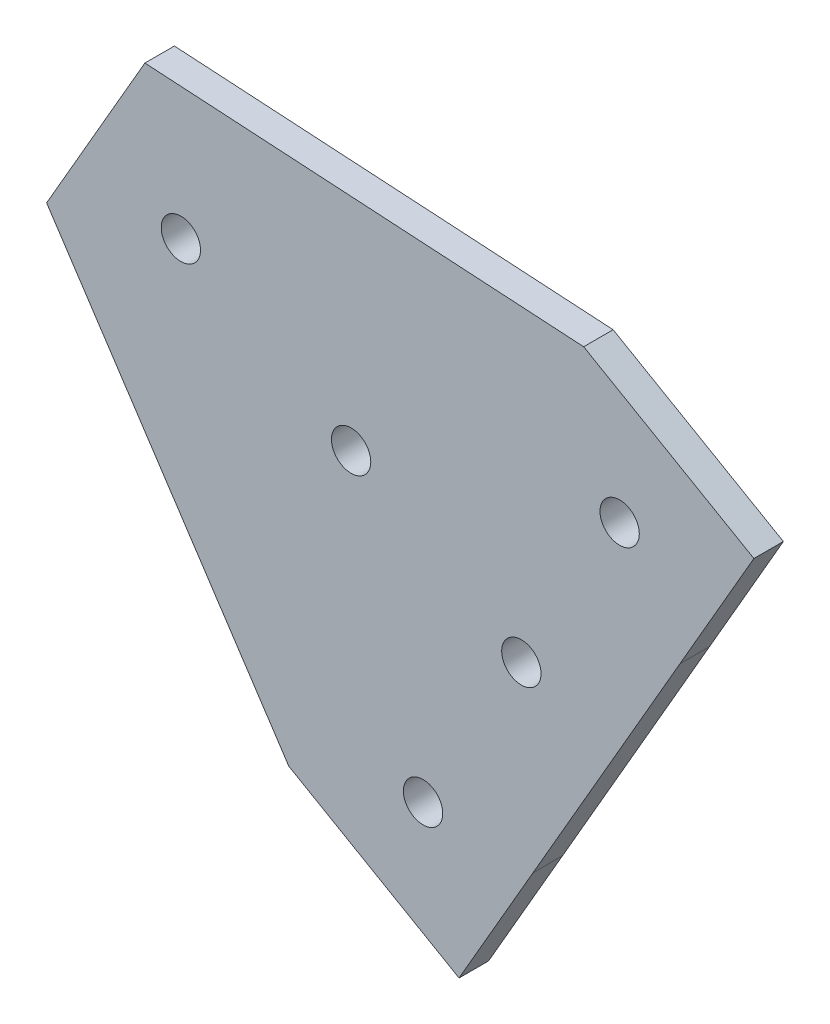
ISO-10303-21;
HEADER;
FILE_DESCRIPTION(('STEP AP214'),'2;1');
FILE_NAME('part.step','',(''),(''),'','','');
FILE_SCHEMA(('AUTOMOTIVE_DESIGN { 1 0 10303 214 1 1 1 1 }'));
ENDSEC;
DATA;
#1=APPLICATION_CONTEXT('core data for automotive mechanical design processes');
#2=APPLICATION_PROTOCOL_DEFINITION('international standard','automotive_design',2000,#1);
#3=PRODUCT_CONTEXT('',#1,'mechanical');
#4=PRODUCT('Part','Part','',(#3));
#5=PRODUCT_RELATED_PRODUCT_CATEGORY('part','',(#4));
#6=PRODUCT_DEFINITION_FORMATION('','',#4);
#7=PRODUCT_DEFINITION_CONTEXT('part definition',#1,'design');
#8=PRODUCT_DEFINITION('design','',#6,#7);
#9=PRODUCT_DEFINITION_SHAPE('','',#8);
#10=(LENGTH_UNIT() NAMED_UNIT(*) SI_UNIT(.MILLI.,.METRE.));
#11=(NAMED_UNIT(*) PLANE_ANGLE_UNIT() SI_UNIT($,.RADIAN.));
#12=(NAMED_UNIT(*) SI_UNIT($,.STERADIAN.) SOLID_ANGLE_UNIT());
#13=UNCERTAINTY_MEASURE_WITH_UNIT(LENGTH_MEASURE(1.E-05),#10,'distance_accuracy_value','');
#14=(GEOMETRIC_REPRESENTATION_CONTEXT(3) GLOBAL_UNCERTAINTY_ASSIGNED_CONTEXT((#13)) GLOBAL_UNIT_ASSIGNED_CONTEXT((#10,
#11,#12)) REPRESENTATION_CONTEXT('',''));
#15=CARTESIAN_POINT('',(0.,0.,0.));
#16=DIRECTION('',(0.,0.,1.));
#17=DIRECTION('',(1.,0.,0.));
#18=AXIS2_PLACEMENT_3D('',#15,#16,#17);
#19=CARTESIAN_POINT('',(-18.8348923040879,-62.367651261605,3.));
#20=DIRECTION('',(0.,0.,1.));
#21=DIRECTION('',(1.,0.,0.));
#22=AXIS2_PLACEMENT_3D('',#19,#20,#21);
#23=PLANE('',#22);
#24=CARTESIAN_POINT('',(-14.3252733608548,-24.5567621291497,3.));
#25=DIRECTION('',(0.,0.,1.));
#26=DIRECTION('',(1.,0.,0.));
#27=AXIS2_PLACEMENT_3D('',#24,#25,#26);
#28=CIRCLE('',#27,2.);
#29=CARTESIAN_POINT('',(-12.3252733608548,-24.5567621291497,3.));
#30=VERTEX_POINT('',#29);
#31=EDGE_CURVE('E271',#30,#30,#28,.T.);
#32=ORIENTED_EDGE('',*,*,#31,.F.);
#33=EDGE_LOOP('',(#32));
#34=FACE_BOUND('',#33,.T.);
#35=CARTESIAN_POINT('',(-41.6457814365435,-31.8772702048387,3.));
#36=DIRECTION('',(0.,0.,1.));
#37=DIRECTION('',(1.,0.,0.));
#38=AXIS2_PLACEMENT_3D('',#35,#36,#37);
#39=CIRCLE('',#38,1.99999999999994);
#40=CARTESIAN_POINT('',(-39.6457814365435,-31.8772702048387,3.));
#41=VERTEX_POINT('',#40);
#42=EDGE_CURVE('E255',#41,#41,#39,.T.);
#43=ORIENTED_EDGE('',*,*,#42,.F.);
#44=EDGE_LOOP('',(#43));
#45=FACE_BOUND('',#44,.T.);
#46=CARTESIAN_POINT('',(-18.8348923040879,-62.367651261605,3.));
#47=DIRECTION('',(0.,0.,-1.));
#48=DIRECTION('',(1.,0.,0.));
#49=AXIS2_PLACEMENT_3D('',#46,#47,#48);
#50=CIRCLE('',#49,5.);
#51=CARTESIAN_POINT('',(-23.1650193230101,-59.8676512616051,3.));
#52=VERTEX_POINT('',#51);
#53=CARTESIAN_POINT('',(-23.1177410915224,-59.7874950136289,3.));
#54=VERTEX_POINT('',#53);
#55=EDGE_CURVE('E188',#52,#54,#50,.T.);
#56=ORIENTED_EDGE('',*,*,#55,.T.);
#57=DIRECTION('',(0.499999999999993,0.866025403784442,0.));
#58=VECTOR('',#57,1.);
#59=CARTESIAN_POINT('',(-23.1177410915224,-59.7874950136289,3.));
#60=LINE('',#59,#58);
#61=CARTESIAN_POINT('',(-8.21079755428733,-33.9679114215767,3.));
#62=VERTEX_POINT('',#61);
#63=EDGE_CURVE('E112',#54,#62,#60,.T.);
#64=ORIENTED_EDGE('',*,*,#63,.T.);
#65=CARTESIAN_POINT('',(-3.83489230408807,-36.3868891480718,3.));
#66=DIRECTION('',(0.,0.,-1.));
#67=DIRECTION('',(1.,0.,0.));
#68=AXIS2_PLACEMENT_3D('',#65,#66,#67);
#69=CIRCLE('',#68,5.00000000000002);
#70=CARTESIAN_POINT('',(-8.16501932301031,-33.8868891480718,3.));
#71=VERTEX_POINT('',#70);
#72=EDGE_CURVE('E217',#62,#71,#69,.T.);
#73=ORIENTED_EDGE('',*,*,#72,.T.);
#74=DIRECTION('',(0.499999999999993,0.866025403784443,0.));
#75=VECTOR('',#74,1.);
#76=CARTESIAN_POINT('',(-8.16501932301028,-33.8868891480718,3.));
#77=LINE('',#76,#75);
#78=CARTESIAN_POINT('',(-0.665019323010385,-20.8965080913052,3.));
#79=VERTEX_POINT('',#78);
#80=EDGE_CURVE('E237',#71,#79,#77,.T.);
#81=ORIENTED_EDGE('',*,*,#80,.T.);
#82=DIRECTION('',(-0.866025403784442,0.499999999999994,0.));
#83=VECTOR('',#82,1.);
#84=CARTESIAN_POINT('',(-0.665019323010385,-20.8965080913052,3.));
#85=LINE('',#84,#83);
#86=CARTESIAN_POINT('',(-17.9855273986992,-10.8965080913053,3.));
#87=VERTEX_POINT('',#86);
#88=EDGE_CURVE('E233',#79,#87,#85,.T.);
#89=ORIENTED_EDGE('',*,*,#88,.T.);
#90=DIRECTION('',(-0.998203466991463,0.0599152608792073,0.));
#91=VECTOR('',#90,1.);
#92=CARTESIAN_POINT('',(-17.9855273986992,-10.8965080913053,3.));
#93=LINE('',#92,#91);
#94=CARTESIAN_POINT('',(-62.6265435500769,-8.21701616699444,3.));
#95=VERTEX_POINT('',#94);
#96=EDGE_CURVE('E236',#87,#95,#93,.T.);
#97=ORIENTED_EDGE('',*,*,#96,.T.);
#98=DIRECTION('',(-0.499999999999992,-0.866025403784443,0.));
#99=VECTOR('',#98,1.);
#100=CARTESIAN_POINT('',(-62.6265435500769,-8.21701616699444,3.));
#101=LINE('',#100,#99);
#102=CARTESIAN_POINT('',(-72.6265435500767,-25.5375242426833,3.));
#103=VERTEX_POINT('',#102);
#104=EDGE_CURVE('E137',#95,#103,#101,.T.);
#105=ORIENTED_EDGE('',*,*,#104,.T.);
#106=DIRECTION('',(0.550989871491512,-0.834511930120695,0.));
#107=VECTOR('',#106,1.);
#108=CARTESIAN_POINT('',(-72.6265435500767,-25.5375242426833,3.));
#109=LINE('',#108,#107);
#110=CARTESIAN_POINT('',(-47.9855273986988,-62.8580323183718,3.));
#111=VERTEX_POINT('',#110);
#112=EDGE_CURVE('E131',#103,#111,#109,.T.);
#113=ORIENTED_EDGE('',*,*,#112,.T.);
#114=DIRECTION('',(0.866025403784442,-0.499999999999994,0.));
#115=VECTOR('',#114,1.);
#116=CARTESIAN_POINT('',(-47.9855273986988,-62.8580323183718,3.));
#117=LINE('',#116,#115);
#118=CARTESIAN_POINT('',(-30.66501932301,-72.8580323183717,3.));
#119=VERTEX_POINT('',#118);
#120=EDGE_CURVE('E135',#111,#119,#117,.T.);
#121=ORIENTED_EDGE('',*,*,#120,.T.);
#122=DIRECTION('',(0.499999999999993,0.866025403784443,0.));
#123=VECTOR('',#122,1.);
#124=CARTESIAN_POINT('',(-30.66501932301,-72.8580323183717,3.));
#125=LINE('',#124,#123);
#126=EDGE_CURVE('E63',#119,#52,#125,.T.);
#127=ORIENTED_EDGE('',*,*,#126,.T.);
#128=EDGE_LOOP('',(#56,#64,#73,#81,#89,#97,#105,#113,#121,#127));
#129=FACE_BOUND('',#128,.T.);
#130=CARTESIAN_POINT('',(-58.9662895122323,-21.8772702048388,3.));
#131=DIRECTION('',(0.,0.,1.));
#132=DIRECTION('',(1.,0.,0.));
#133=AXIS2_PLACEMENT_3D('',#130,#131,#132);
#134=CIRCLE('',#133,2.);
#135=CARTESIAN_POINT('',(-56.9662895122323,-21.8772702048388,3.));
#136=VERTEX_POINT('',#135);
#137=EDGE_CURVE('E164',#136,#136,#134,.T.);
#138=ORIENTED_EDGE('',*,*,#137,.F.);
#139=EDGE_LOOP('',(#138));
#140=FACE_BOUND('',#139,.T.);
#141=CARTESIAN_POINT('',(-24.3252733608546,-41.8772702048386,3.));
#142=DIRECTION('',(0.,0.,1.));
#143=DIRECTION('',(1.,0.,0.));
#144=AXIS2_PLACEMENT_3D('',#141,#142,#143);
#145=CIRCLE('',#144,2.);
#146=CARTESIAN_POINT('',(-22.3252733608546,-41.8772702048386,3.));
#147=VERTEX_POINT('',#146);
#148=EDGE_CURVE('E263',#147,#147,#145,.T.);
#149=ORIENTED_EDGE('',*,*,#148,.F.);
#150=EDGE_LOOP('',(#149));
#151=FACE_BOUND('',#150,.T.);
#152=CARTESIAN_POINT('',(-34.3252733608544,-59.1977782805274,3.));
#153=DIRECTION('',(0.,0.,1.));
#154=DIRECTION('',(1.,0.,0.));
#155=AXIS2_PLACEMENT_3D('',#152,#153,#154);
#156=CIRCLE('',#155,2.);
#157=CARTESIAN_POINT('',(-32.3252733608545,-59.1977782805274,3.));
#158=VERTEX_POINT('',#157);
#159=EDGE_CURVE('E279',#158,#158,#156,.T.);
#160=ORIENTED_EDGE('',*,*,#159,.F.);
#161=EDGE_LOOP('',(#160));
#162=FACE_BOUND('',#161,.T.);
#163=ADVANCED_FACE('F45',(#34,#45,#129,#140,#151,#162),#23,.T.);
#164=CARTESIAN_POINT('',(-18.8348923040879,-62.367651261605,0.));
#165=DIRECTION('',(0.,0.,1.));
#166=DIRECTION('',(1.,0.,0.));
#167=AXIS2_PLACEMENT_3D('',#164,#165,#166);
#168=PLANE('',#167);
#169=CARTESIAN_POINT('',(-18.8348923040879,-62.367651261605,0.));
#170=DIRECTION('',(0.,0.,-1.));
#171=DIRECTION('',(1.,0.,0.));
#172=AXIS2_PLACEMENT_3D('',#169,#170,#171);
#173=CIRCLE('',#172,5.);
#174=CARTESIAN_POINT('',(-23.1650193230101,-59.8676512616051,0.));
#175=VERTEX_POINT('',#174);
#176=CARTESIAN_POINT('',(-23.1177410915224,-59.7874950136289,0.));
#177=VERTEX_POINT('',#176);
#178=EDGE_CURVE('E159',#175,#177,#173,.T.);
#179=ORIENTED_EDGE('',*,*,#178,.F.);
#180=DIRECTION('',(0.499999999999993,0.866025403784443,0.));
#181=VECTOR('',#180,1.);
#182=CARTESIAN_POINT('',(-30.66501932301,-72.8580323183717,0.));
#183=LINE('',#182,#181);
#184=CARTESIAN_POINT('',(-30.66501932301,-72.8580323183717,0.));
#185=VERTEX_POINT('',#184);
#186=EDGE_CURVE('E104',#185,#175,#183,.T.);
#187=ORIENTED_EDGE('',*,*,#186,.F.);
#188=DIRECTION('',(0.866025403784442,-0.499999999999994,0.));
#189=VECTOR('',#188,1.);
#190=CARTESIAN_POINT('',(-47.9855273986988,-62.8580323183718,0.));
#191=LINE('',#190,#189);
#192=CARTESIAN_POINT('',(-47.9855273986988,-62.8580323183718,0.));
#193=VERTEX_POINT('',#192);
#194=EDGE_CURVE('E98',#193,#185,#191,.T.);
#195=ORIENTED_EDGE('',*,*,#194,.F.);
#196=DIRECTION('',(0.550989871491512,-0.834511930120695,0.));
#197=VECTOR('',#196,1.);
#198=CARTESIAN_POINT('',(-72.6265435500767,-25.5375242426833,0.));
#199=LINE('',#198,#197);
#200=CARTESIAN_POINT('',(-72.6265435500767,-25.5375242426833,0.));
#201=VERTEX_POINT('',#200);
#202=EDGE_CURVE('E146',#201,#193,#199,.T.);
#203=ORIENTED_EDGE('',*,*,#202,.F.);
#204=DIRECTION('',(-0.499999999999992,-0.866025403784443,0.));
#205=VECTOR('',#204,1.);
#206=CARTESIAN_POINT('',(-62.6265435500769,-8.21701616699444,0.));
#207=LINE('',#206,#205);
#208=CARTESIAN_POINT('',(-62.6265435500769,-8.21701616699444,0.));
#209=VERTEX_POINT('',#208);
#210=EDGE_CURVE('E179',#209,#201,#207,.T.);
#211=ORIENTED_EDGE('',*,*,#210,.F.);
#212=DIRECTION('',(-0.998203466991463,0.0599152608792073,0.));
#213=VECTOR('',#212,1.);
#214=CARTESIAN_POINT('',(-17.9855273986992,-10.8965080913053,0.));
#215=LINE('',#214,#213);
#216=CARTESIAN_POINT('',(-17.9855273986992,-10.8965080913053,0.));
#217=VERTEX_POINT('',#216);
#218=EDGE_CURVE('E176',#217,#209,#215,.T.);
#219=ORIENTED_EDGE('',*,*,#218,.F.);
#220=DIRECTION('',(-0.866025403784442,0.499999999999994,0.));
#221=VECTOR('',#220,1.);
#222=CARTESIAN_POINT('',(-0.665019323010385,-20.8965080913052,0.));
#223=LINE('',#222,#221);
#224=CARTESIAN_POINT('',(-0.665019323010385,-20.8965080913052,0.));
#225=VERTEX_POINT('',#224);
#226=EDGE_CURVE('E173',#225,#217,#223,.T.);
#227=ORIENTED_EDGE('',*,*,#226,.F.);
#228=DIRECTION('',(0.499999999999993,0.866025403784443,0.));
#229=VECTOR('',#228,1.);
#230=CARTESIAN_POINT('',(-8.16501932301028,-33.8868891480718,0.));
#231=LINE('',#230,#229);
#232=CARTESIAN_POINT('',(-8.16501932301031,-33.8868891480718,0.));
#233=VERTEX_POINT('',#232);
#234=EDGE_CURVE('E170',#233,#225,#231,.T.);
#235=ORIENTED_EDGE('',*,*,#234,.F.);
#236=CARTESIAN_POINT('',(-3.83489230408807,-36.3868891480718,0.));
#237=DIRECTION('',(0.,0.,-1.));
#238=DIRECTION('',(1.,0.,0.));
#239=AXIS2_PLACEMENT_3D('',#236,#237,#238);
#240=CIRCLE('',#239,5.00000000000002);
#241=CARTESIAN_POINT('',(-8.21079755428733,-33.9679114215767,0.));
#242=VERTEX_POINT('',#241);
#243=EDGE_CURVE('E167',#242,#233,#240,.T.);
#244=ORIENTED_EDGE('',*,*,#243,.F.);
#245=DIRECTION('',(0.499999999999993,0.866025403784442,0.));
#246=VECTOR('',#245,1.);
#247=CARTESIAN_POINT('',(-23.1177410915224,-59.7874950136289,0.));
#248=LINE('',#247,#246);
#249=EDGE_CURVE('E163',#177,#242,#248,.T.);
#250=ORIENTED_EDGE('',*,*,#249,.F.);
#251=EDGE_LOOP('',(#179,#187,#195,#203,#211,#219,#227,#235,#244,#250));
#252=FACE_BOUND('',#251,.T.);
#253=CARTESIAN_POINT('',(-58.9662895122323,-21.8772702048388,0.));
#254=DIRECTION('',(0.,0.,1.));
#255=DIRECTION('',(1.,0.,0.));
#256=AXIS2_PLACEMENT_3D('',#253,#254,#255);
#257=CIRCLE('',#256,2.);
#258=CARTESIAN_POINT('',(-56.9662895122323,-21.8772702048388,0.));
#259=VERTEX_POINT('',#258);
#260=EDGE_CURVE('E251',#259,#259,#257,.T.);
#261=ORIENTED_EDGE('',*,*,#260,.T.);
#262=EDGE_LOOP('',(#261));
#263=FACE_BOUND('',#262,.T.);
#264=CARTESIAN_POINT('',(-41.6457814365435,-31.8772702048387,0.));
#265=DIRECTION('',(0.,0.,1.));
#266=DIRECTION('',(1.,0.,0.));
#267=AXIS2_PLACEMENT_3D('',#264,#265,#266);
#268=CIRCLE('',#267,1.99999999999994);
#269=CARTESIAN_POINT('',(-39.6457814365435,-31.8772702048387,0.));
#270=VERTEX_POINT('',#269);
#271=EDGE_CURVE('E259',#270,#270,#268,.T.);
#272=ORIENTED_EDGE('',*,*,#271,.T.);
#273=EDGE_LOOP('',(#272));
#274=FACE_BOUND('',#273,.T.);
#275=CARTESIAN_POINT('',(-24.3252733608546,-41.8772702048386,0.));
#276=DIRECTION('',(0.,0.,1.));
#277=DIRECTION('',(1.,0.,0.));
#278=AXIS2_PLACEMENT_3D('',#275,#276,#277);
#279=CIRCLE('',#278,2.);
#280=CARTESIAN_POINT('',(-22.3252733608546,-41.8772702048386,0.));
#281=VERTEX_POINT('',#280);
#282=EDGE_CURVE('E267',#281,#281,#279,.T.);
#283=ORIENTED_EDGE('',*,*,#282,.T.);
#284=EDGE_LOOP('',(#283));
#285=FACE_BOUND('',#284,.T.);
#286=CARTESIAN_POINT('',(-14.3252733608548,-24.5567621291497,0.));
#287=DIRECTION('',(0.,0.,1.));
#288=DIRECTION('',(1.,0.,0.));
#289=AXIS2_PLACEMENT_3D('',#286,#287,#288);
#290=CIRCLE('',#289,2.);
#291=CARTESIAN_POINT('',(-12.3252733608548,-24.5567621291497,0.));
#292=VERTEX_POINT('',#291);
#293=EDGE_CURVE('E275',#292,#292,#290,.T.);
#294=ORIENTED_EDGE('',*,*,#293,.T.);
#295=EDGE_LOOP('',(#294));
#296=FACE_BOUND('',#295,.T.);
#297=CARTESIAN_POINT('',(-34.3252733608544,-59.1977782805274,0.));
#298=DIRECTION('',(0.,0.,1.));
#299=DIRECTION('',(1.,0.,0.));
#300=AXIS2_PLACEMENT_3D('',#297,#298,#299);
#301=CIRCLE('',#300,2.);
#302=CARTESIAN_POINT('',(-32.3252733608545,-59.1977782805274,0.));
#303=VERTEX_POINT('',#302);
#304=EDGE_CURVE('E283',#303,#303,#301,.T.);
#305=ORIENTED_EDGE('',*,*,#304,.T.);
#306=EDGE_LOOP('',(#305));
#307=FACE_BOUND('',#306,.T.);
#308=ADVANCED_FACE('F221',(#252,#263,#274,#285,#296,#307),#168,.F.);
#309=CARTESIAN_POINT('',(-18.8348923040879,-62.367651261605,3.));
#310=DIRECTION('',(0.,0.,-1.));
#311=DIRECTION('',(-1.,0.,0.));
#312=AXIS2_PLACEMENT_3D('',#309,#310,#311);
#313=CYLINDRICAL_SURFACE('',#312,5.);
#314=ORIENTED_EDGE('',*,*,#178,.T.);
#315=DIRECTION('',(0.,0.,-1.));
#316=VECTOR('',#315,1.);
#317=CARTESIAN_POINT('',(-23.1177410915224,-59.7874950136289,3.));
#318=LINE('',#317,#316);
#319=EDGE_CURVE('E11',#54,#177,#318,.T.);
#320=ORIENTED_EDGE('',*,*,#319,.F.);
#321=ORIENTED_EDGE('',*,*,#55,.F.);
#322=DIRECTION('',(0.,0.,-1.));
#323=VECTOR('',#322,1.);
#324=CARTESIAN_POINT('',(-23.1650193230101,-59.8676512616051,3.));
#325=LINE('',#324,#323);
#326=EDGE_CURVE('E155',#52,#175,#325,.T.);
#327=ORIENTED_EDGE('',*,*,#326,.T.);
#328=EDGE_LOOP('',(#314,#320,#321,#327));
#329=FACE_BOUND('',#328,.T.);
#330=ADVANCED_FACE('F47',(#329),#313,.F.);
#331=CARTESIAN_POINT('',(-23.1177410915224,-59.7874950136289,3.));
#332=DIRECTION('',(-0.866025403784442,0.499999999999993,0.));
#333=DIRECTION('',(-0.499999999999993,-0.866025403784442,0.));
#334=AXIS2_PLACEMENT_3D('',#331,#332,#333);
#335=PLANE('',#334);
#336=ORIENTED_EDGE('',*,*,#249,.T.);
#337=DIRECTION('',(0.,0.,-1.));
#338=VECTOR('',#337,1.);
#339=CARTESIAN_POINT('',(-8.21079755428733,-33.9679114215767,3.));
#340=LINE('',#339,#338);
#341=EDGE_CURVE('E55',#62,#242,#340,.T.);
#342=ORIENTED_EDGE('',*,*,#341,.F.);
#343=ORIENTED_EDGE('',*,*,#63,.F.);
#344=ORIENTED_EDGE('',*,*,#319,.T.);
#345=EDGE_LOOP('',(#336,#342,#343,#344));
#346=FACE_BOUND('',#345,.T.);
#347=ADVANCED_FACE('F327',(#346),#335,.F.);
#348=CARTESIAN_POINT('',(-3.83489230408807,-36.3868891480718,3.));
#349=DIRECTION('',(0.,0.,-1.));
#350=DIRECTION('',(-1.,0.,0.));
#351=AXIS2_PLACEMENT_3D('',#348,#349,#350);
#352=CYLINDRICAL_SURFACE('',#351,5.00000000000002);
#353=ORIENTED_EDGE('',*,*,#243,.T.);
#354=DIRECTION('',(0.,0.,-1.));
#355=VECTOR('',#354,1.);
#356=CARTESIAN_POINT('',(-8.16501932301031,-33.8868891480718,3.));
#357=LINE('',#356,#355);
#358=EDGE_CURVE('E207',#71,#233,#357,.T.);
#359=ORIENTED_EDGE('',*,*,#358,.F.);
#360=ORIENTED_EDGE('',*,*,#72,.F.);
#361=ORIENTED_EDGE('',*,*,#341,.T.);
#362=EDGE_LOOP('',(#353,#359,#360,#361));
#363=FACE_BOUND('',#362,.T.);
#364=ADVANCED_FACE('F215',(#363),#352,.F.);
#365=CARTESIAN_POINT('',(-8.16501932301028,-33.8868891480718,3.));
#366=DIRECTION('',(-0.866025403784443,0.499999999999993,0.));
#367=DIRECTION('',(-0.499999999999993,-0.866025403784443,0.));
#368=AXIS2_PLACEMENT_3D('',#365,#366,#367);
#369=PLANE('',#368);
#370=ORIENTED_EDGE('',*,*,#234,.T.);
#371=DIRECTION('',(0.,0.,-1.));
#372=VECTOR('',#371,1.);
#373=CARTESIAN_POINT('',(-0.665019323010385,-20.8965080913052,3.));
#374=LINE('',#373,#372);
#375=EDGE_CURVE('E203',#79,#225,#374,.T.);
#376=ORIENTED_EDGE('',*,*,#375,.F.);
#377=ORIENTED_EDGE('',*,*,#80,.F.);
#378=ORIENTED_EDGE('',*,*,#358,.T.);
#379=EDGE_LOOP('',(#370,#376,#377,#378));
#380=FACE_BOUND('',#379,.T.);
#381=ADVANCED_FACE('F227',(#380),#369,.F.);
#382=CARTESIAN_POINT('',(-0.665019323010385,-20.8965080913052,3.));
#383=DIRECTION('',(-0.499999999999994,-0.866025403784442,0.));
#384=DIRECTION('',(0.866025403784442,-0.499999999999994,0.));
#385=AXIS2_PLACEMENT_3D('',#382,#383,#384);
#386=PLANE('',#385);
#387=ORIENTED_EDGE('',*,*,#226,.T.);
#388=DIRECTION('',(0.,0.,-1.));
#389=VECTOR('',#388,1.);
#390=CARTESIAN_POINT('',(-17.9855273986992,-10.8965080913053,3.));
#391=LINE('',#390,#389);
#392=EDGE_CURVE('E199',#87,#217,#391,.T.);
#393=ORIENTED_EDGE('',*,*,#392,.F.);
#394=ORIENTED_EDGE('',*,*,#88,.F.);
#395=ORIENTED_EDGE('',*,*,#375,.T.);
#396=EDGE_LOOP('',(#387,#393,#394,#395));
#397=FACE_BOUND('',#396,.T.);
#398=ADVANCED_FACE('F231',(#397),#386,.F.);
#399=CARTESIAN_POINT('',(-17.9855273986992,-10.8965080913053,3.));
#400=DIRECTION('',(-0.0599152608792073,-0.998203466991463,0.));
#401=DIRECTION('',(0.998203466991463,-0.0599152608792073,0.));
#402=AXIS2_PLACEMENT_3D('',#399,#400,#401);
#403=PLANE('',#402);
#404=ORIENTED_EDGE('',*,*,#218,.T.);
#405=DIRECTION('',(0.,0.,-1.));
#406=VECTOR('',#405,1.);
#407=CARTESIAN_POINT('',(-62.6265435500769,-8.21701616699444,3.));
#408=LINE('',#407,#406);
#409=EDGE_CURVE('E195',#95,#209,#408,.T.);
#410=ORIENTED_EDGE('',*,*,#409,.F.);
#411=ORIENTED_EDGE('',*,*,#96,.F.);
#412=ORIENTED_EDGE('',*,*,#392,.T.);
#413=EDGE_LOOP('',(#404,#410,#411,#412));
#414=FACE_BOUND('',#413,.T.);
#415=ADVANCED_FACE('F317',(#414),#403,.F.);
#416=CARTESIAN_POINT('',(-62.6265435500769,-8.21701616699444,3.));
#417=DIRECTION('',(0.866025403784443,-0.499999999999992,0.));
#418=DIRECTION('',(0.499999999999992,0.866025403784443,0.));
#419=AXIS2_PLACEMENT_3D('',#416,#417,#418);
#420=PLANE('',#419);
#421=ORIENTED_EDGE('',*,*,#210,.T.);
#422=DIRECTION('',(0.,0.,-1.));
#423=VECTOR('',#422,1.);
#424=CARTESIAN_POINT('',(-72.6265435500767,-25.5375242426833,3.));
#425=LINE('',#424,#423);
#426=EDGE_CURVE('E148',#103,#201,#425,.T.);
#427=ORIENTED_EDGE('',*,*,#426,.F.);
#428=ORIENTED_EDGE('',*,*,#104,.F.);
#429=ORIENTED_EDGE('',*,*,#409,.T.);
#430=EDGE_LOOP('',(#421,#427,#428,#429));
#431=FACE_BOUND('',#430,.T.);
#432=ADVANCED_FACE('F314',(#431),#420,.F.);
#433=CARTESIAN_POINT('',(-72.6265435500767,-25.5375242426833,3.));
#434=DIRECTION('',(0.834511930120695,0.550989871491512,0.));
#435=DIRECTION('',(-0.550989871491512,0.834511930120695,0.));
#436=AXIS2_PLACEMENT_3D('',#433,#434,#435);
#437=PLANE('',#436);
#438=ORIENTED_EDGE('',*,*,#202,.T.);
#439=DIRECTION('',(0.,0.,-1.));
#440=VECTOR('',#439,1.);
#441=CARTESIAN_POINT('',(-47.9855273986988,-62.8580323183718,3.));
#442=LINE('',#441,#440);
#443=EDGE_CURVE('E143',#111,#193,#442,.T.);
#444=ORIENTED_EDGE('',*,*,#443,.F.);
#445=ORIENTED_EDGE('',*,*,#112,.F.);
#446=ORIENTED_EDGE('',*,*,#426,.T.);
#447=EDGE_LOOP('',(#438,#444,#445,#446));
#448=FACE_BOUND('',#447,.T.);
#449=ADVANCED_FACE('F144',(#448),#437,.F.);
#450=CARTESIAN_POINT('',(-47.9855273986988,-62.8580323183718,3.));
#451=DIRECTION('',(0.499999999999994,0.866025403784442,0.));
#452=DIRECTION('',(-0.866025403784442,0.499999999999994,0.));
#453=AXIS2_PLACEMENT_3D('',#450,#451,#452);
#454=PLANE('',#453);
#455=ORIENTED_EDGE('',*,*,#194,.T.);
#456=DIRECTION('',(0.,0.,-1.));
#457=VECTOR('',#456,1.);
#458=CARTESIAN_POINT('',(-30.66501932301,-72.8580323183717,3.));
#459=LINE('',#458,#457);
#460=EDGE_CURVE('E149',#119,#185,#459,.T.);
#461=ORIENTED_EDGE('',*,*,#460,.F.);
#462=ORIENTED_EDGE('',*,*,#120,.F.);
#463=ORIENTED_EDGE('',*,*,#443,.T.);
#464=EDGE_LOOP('',(#455,#461,#462,#463));
#465=FACE_BOUND('',#464,.T.);
#466=ADVANCED_FACE('F151',(#465),#454,.F.);
#467=CARTESIAN_POINT('',(-30.66501932301,-72.8580323183717,3.));
#468=DIRECTION('',(-0.866025403784443,0.499999999999993,0.));
#469=DIRECTION('',(-0.499999999999993,-0.866025403784443,0.));
#470=AXIS2_PLACEMENT_3D('',#467,#468,#469);
#471=PLANE('',#470);
#472=ORIENTED_EDGE('',*,*,#186,.T.);
#473=ORIENTED_EDGE('',*,*,#326,.F.);
#474=ORIENTED_EDGE('',*,*,#126,.F.);
#475=ORIENTED_EDGE('',*,*,#460,.T.);
#476=EDGE_LOOP('',(#472,#473,#474,#475));
#477=FACE_BOUND('',#476,.T.);
#478=ADVANCED_FACE('F307',(#477),#471,.F.);
#479=CARTESIAN_POINT('',(-58.9662895122323,-21.8772702048388,3.));
#480=DIRECTION('',(0.,0.,-1.));
#481=DIRECTION('',(-1.,0.,0.));
#482=AXIS2_PLACEMENT_3D('',#479,#480,#481);
#483=CYLINDRICAL_SURFACE('',#482,2.);
#484=ORIENTED_EDGE('',*,*,#137,.T.);
#485=EDGE_LOOP('',(#484));
#486=FACE_BOUND('',#485,.T.);
#487=ORIENTED_EDGE('',*,*,#260,.F.);
#488=EDGE_LOOP('',(#487));
#489=FACE_BOUND('',#488,.T.);
#490=ADVANCED_FACE('F304',(#486,#489),#483,.F.);
#491=CARTESIAN_POINT('',(-41.6457814365435,-31.8772702048387,3.));
#492=DIRECTION('',(0.,0.,-1.));
#493=DIRECTION('',(-1.,0.,0.));
#494=AXIS2_PLACEMENT_3D('',#491,#492,#493);
#495=CYLINDRICAL_SURFACE('',#494,1.99999999999994);
#496=ORIENTED_EDGE('',*,*,#42,.T.);
#497=EDGE_LOOP('',(#496));
#498=FACE_BOUND('',#497,.T.);
#499=ORIENTED_EDGE('',*,*,#271,.F.);
#500=EDGE_LOOP('',(#499));
#501=FACE_BOUND('',#500,.T.);
#502=ADVANCED_FACE('F402',(#498,#501),#495,.F.);
#503=CARTESIAN_POINT('',(-24.3252733608546,-41.8772702048386,3.));
#504=DIRECTION('',(0.,0.,-1.));
#505=DIRECTION('',(-1.,0.,0.));
#506=AXIS2_PLACEMENT_3D('',#503,#504,#505);
#507=CYLINDRICAL_SURFACE('',#506,2.);
#508=ORIENTED_EDGE('',*,*,#148,.T.);
#509=EDGE_LOOP('',(#508));
#510=FACE_BOUND('',#509,.T.);
#511=ORIENTED_EDGE('',*,*,#282,.F.);
#512=EDGE_LOOP('',(#511));
#513=FACE_BOUND('',#512,.T.);
#514=ADVANCED_FACE('F410',(#510,#513),#507,.F.);
#515=CARTESIAN_POINT('',(-14.3252733608548,-24.5567621291497,3.));
#516=DIRECTION('',(0.,0.,-1.));
#517=DIRECTION('',(-1.,0.,0.));
#518=AXIS2_PLACEMENT_3D('',#515,#516,#517);
#519=CYLINDRICAL_SURFACE('',#518,2.);
#520=ORIENTED_EDGE('',*,*,#31,.T.);
#521=EDGE_LOOP('',(#520));
#522=FACE_BOUND('',#521,.T.);
#523=ORIENTED_EDGE('',*,*,#293,.F.);
#524=EDGE_LOOP('',(#523));
#525=FACE_BOUND('',#524,.T.);
#526=ADVANCED_FACE('F418',(#522,#525),#519,.F.);
#527=CARTESIAN_POINT('',(-34.3252733608544,-59.1977782805274,3.));
#528=DIRECTION('',(0.,0.,-1.));
#529=DIRECTION('',(-1.,0.,0.));
#530=AXIS2_PLACEMENT_3D('',#527,#528,#529);
#531=CYLINDRICAL_SURFACE('',#530,2.);
#532=ORIENTED_EDGE('',*,*,#159,.T.);
#533=EDGE_LOOP('',(#532));
#534=FACE_BOUND('',#533,.T.);
#535=ORIENTED_EDGE('',*,*,#304,.F.);
#536=EDGE_LOOP('',(#535));
#537=FACE_BOUND('',#536,.T.);
#538=ADVANCED_FACE('F291',(#534,#537),#531,.F.);
#539=CLOSED_SHELL('',(#163,#308,#330,#347,#364,#381,#398,#415,#432,#449,#466,#478,#490,#502,
#514,#526,#538));
#540=MANIFOLD_SOLID_BREP('B2',#539);
#541=ADVANCED_BREP_SHAPE_REPRESENTATION('',(#18,#540),#14);
#542=SHAPE_DEFINITION_REPRESENTATION(#9,#541);
ENDSEC;
END-ISO-10303-21;
